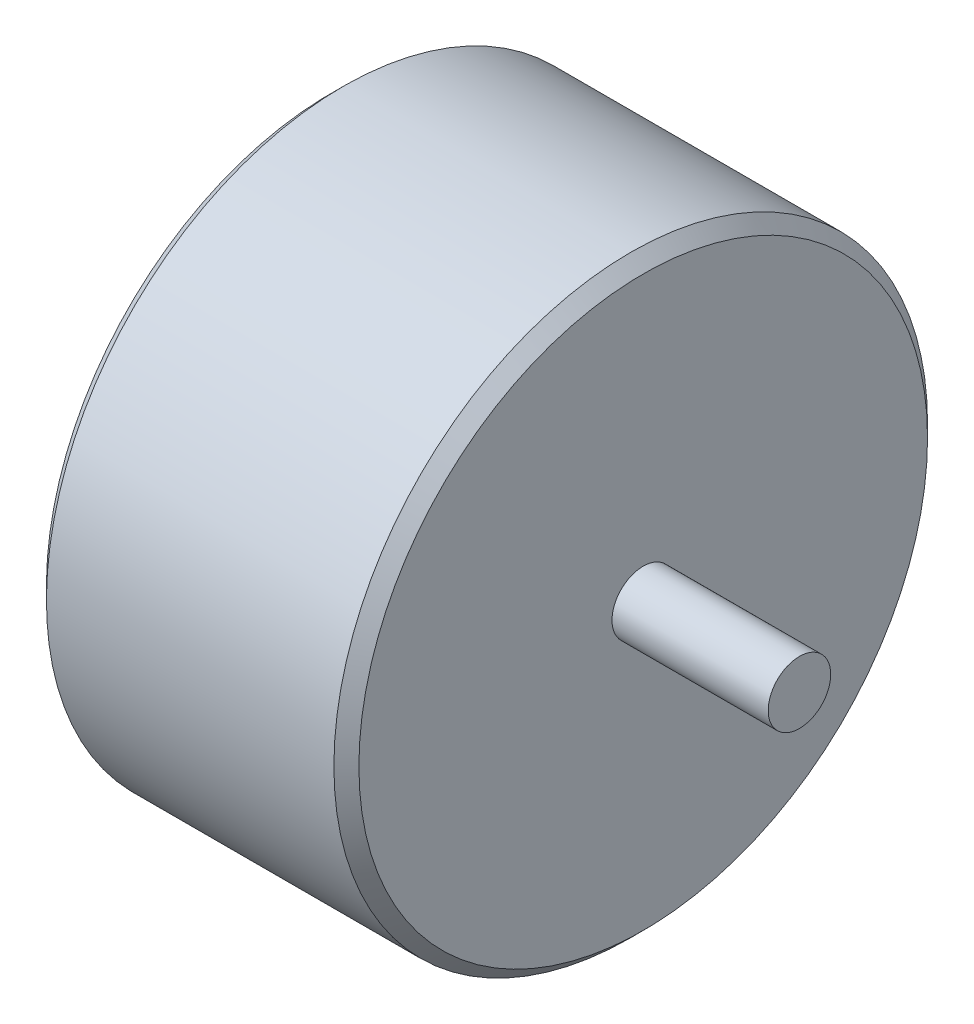
ISO-10303-21;
HEADER;
FILE_DESCRIPTION(('STEP AP214'),'2;1');
FILE_NAME('part.step','',(''),(''),'','','');
FILE_SCHEMA(('AUTOMOTIVE_DESIGN { 1 0 10303 214 1 1 1 1 }'));
ENDSEC;
DATA;
#1=APPLICATION_CONTEXT('core data for automotive mechanical design processes');
#2=APPLICATION_PROTOCOL_DEFINITION('international standard','automotive_design',2000,#1);
#3=PRODUCT_CONTEXT('',#1,'mechanical');
#4=PRODUCT('Part','Part','',(#3));
#5=PRODUCT_RELATED_PRODUCT_CATEGORY('part','',(#4));
#6=PRODUCT_DEFINITION_FORMATION('','',#4);
#7=PRODUCT_DEFINITION_CONTEXT('part definition',#1,'design');
#8=PRODUCT_DEFINITION('design','',#6,#7);
#9=PRODUCT_DEFINITION_SHAPE('','',#8);
#10=(LENGTH_UNIT() NAMED_UNIT(*) SI_UNIT(.MILLI.,.METRE.));
#11=(NAMED_UNIT(*) PLANE_ANGLE_UNIT() SI_UNIT($,.RADIAN.));
#12=(NAMED_UNIT(*) SI_UNIT($,.STERADIAN.) SOLID_ANGLE_UNIT());
#13=UNCERTAINTY_MEASURE_WITH_UNIT(LENGTH_MEASURE(1.E-05),#10,'distance_accuracy_value','');
#14=(GEOMETRIC_REPRESENTATION_CONTEXT(3) GLOBAL_UNCERTAINTY_ASSIGNED_CONTEXT((#13)) GLOBAL_UNIT_ASSIGNED_CONTEXT((#10,
#11,#12)) REPRESENTATION_CONTEXT('',''));
#15=CARTESIAN_POINT('',(0.,0.,0.));
#16=DIRECTION('',(0.,0.,1.));
#17=DIRECTION('',(1.,0.,0.));
#18=AXIS2_PLACEMENT_3D('',#15,#16,#17);
#19=CARTESIAN_POINT('',(12.7,0.,0.));
#20=DIRECTION('',(-1.,0.,0.));
#21=DIRECTION('',(0.,0.,1.));
#22=AXIS2_PLACEMENT_3D('',#19,#20,#21);
#23=CYLINDRICAL_SURFACE('',#22,12.065);
#24=CARTESIAN_POINT('',(12.192,0.,0.));
#25=DIRECTION('',(1.,0.,0.));
#26=DIRECTION('',(0.,0.,-1.));
#27=AXIS2_PLACEMENT_3D('',#24,#25,#26);
#28=CIRCLE('',#27,12.065);
#29=CARTESIAN_POINT('',(12.192,0.,-12.065));
#30=VERTEX_POINT('',#29);
#31=EDGE_CURVE('E127',#30,#30,#28,.F.);
#32=ORIENTED_EDGE('',*,*,#31,.T.);
#33=EDGE_LOOP('',(#32));
#34=FACE_BOUND('',#33,.T.);
#35=DIRECTION('',(-1.,0.,0.));
#36=VECTOR('',#35,1.);
#37=CARTESIAN_POINT('',(12.7,4.15899426881129,-11.3255018287048));
#38=LINE('',#37,#36);
#39=CARTESIAN_POINT('',(3.81,4.15899426881129,-11.3255018287048));
#40=VERTEX_POINT('',#39);
#41=CARTESIAN_POINT('',(0.507999999999998,4.15899426881129,-11.3255018287048));
#42=VERTEX_POINT('',#41);
#43=EDGE_CURVE('E99',#40,#42,#38,.T.);
#44=ORIENTED_EDGE('',*,*,#43,.T.);
#45=CARTESIAN_POINT('',(0.507999999999998,0.,0.));
#46=DIRECTION('',(1.,0.,0.));
#47=DIRECTION('',(0.,0.,-1.));
#48=AXIS2_PLACEMENT_3D('',#45,#46,#47);
#49=CIRCLE('',#48,12.065);
#50=CARTESIAN_POINT('',(0.507999999999998,-3.6130259091989,-11.5113104718558));
#51=VERTEX_POINT('',#50);
#52=EDGE_CURVE('E130',#42,#51,#49,.T.);
#53=ORIENTED_EDGE('',*,*,#52,.T.);
#54=DIRECTION('',(-1.,0.,0.));
#55=VECTOR('',#54,1.);
#56=CARTESIAN_POINT('',(12.7,-3.6130259091989,-11.5113104718558));
#57=LINE('',#56,#55);
#58=CARTESIAN_POINT('',(3.81,-3.6130259091989,-11.5113104718558));
#59=VERTEX_POINT('',#58);
#60=EDGE_CURVE('E115',#51,#59,#57,.F.);
#61=ORIENTED_EDGE('',*,*,#60,.T.);
#62=CARTESIAN_POINT('',(3.81,0.,0.));
#63=DIRECTION('',(1.,0.,0.));
#64=DIRECTION('',(0.,0.,-1.));
#65=AXIS2_PLACEMENT_3D('',#62,#63,#64);
#66=CIRCLE('',#65,12.065);
#67=EDGE_CURVE('E125',#59,#40,#66,.T.);
#68=ORIENTED_EDGE('',*,*,#67,.T.);
#69=EDGE_LOOP('',(#44,#53,#61,#68));
#70=FACE_BOUND('',#69,.T.);
#71=ADVANCED_FACE('F35',(#34,#70),#23,.T.);
#72=CARTESIAN_POINT('',(12.7,0.,0.));
#73=DIRECTION('',(1.,0.,0.));
#74=DIRECTION('',(0.,0.,-1.));
#75=AXIS2_PLACEMENT_3D('',#72,#73,#74);
#76=PLANE('',#75);
#77=CARTESIAN_POINT('',(12.7,0.,0.));
#78=DIRECTION('',(1.,0.,0.));
#79=DIRECTION('',(0.,0.,-1.));
#80=AXIS2_PLACEMENT_3D('',#77,#78,#79);
#81=CIRCLE('',#80,11.557);
#82=CARTESIAN_POINT('',(12.7,0.,-11.557));
#83=VERTEX_POINT('',#82);
#84=EDGE_CURVE('E11',#83,#83,#81,.T.);
#85=ORIENTED_EDGE('',*,*,#84,.T.);
#86=EDGE_LOOP('',(#85));
#87=FACE_BOUND('',#86,.T.);
#88=CARTESIAN_POINT('',(12.7,0.,0.));
#89=DIRECTION('',(1.,0.,0.));
#90=DIRECTION('',(0.,0.,-1.));
#91=AXIS2_PLACEMENT_3D('',#88,#89,#90);
#92=CIRCLE('',#91,1.27);
#93=CARTESIAN_POINT('',(12.7,0.,-1.27));
#94=VERTEX_POINT('',#93);
#95=EDGE_CURVE('E117',#94,#94,#92,.T.);
#96=ORIENTED_EDGE('',*,*,#95,.F.);
#97=EDGE_LOOP('',(#96));
#98=FACE_BOUND('',#97,.T.);
#99=ADVANCED_FACE('F164',(#87,#98),#76,.T.);
#100=CARTESIAN_POINT('',(0.,0.,0.));
#101=DIRECTION('',(1.,0.,0.));
#102=DIRECTION('',(0.,0.,-1.));
#103=AXIS2_PLACEMENT_3D('',#100,#101,#102);
#104=PLANE('',#103);
#105=DIRECTION('',(0.,0.,-1.));
#106=VECTOR('',#105,1.);
#107=CARTESIAN_POINT('',(0.,-3.6130259091989,0.));
#108=LINE('',#107,#106);
#109=CARTESIAN_POINT('',(0.,-3.6130259091989,-8.67126218207749));
#110=VERTEX_POINT('',#109);
#111=CARTESIAN_POINT('',(0.,-3.6130259091989,-10.9777180132966));
#112=VERTEX_POINT('',#111);
#113=EDGE_CURVE('E121',#110,#112,#108,.T.);
#114=ORIENTED_EDGE('',*,*,#113,.T.);
#115=CARTESIAN_POINT('',(0.,0.,0.));
#116=DIRECTION('',(1.,0.,0.));
#117=DIRECTION('',(0.,0.,-1.));
#118=AXIS2_PLACEMENT_3D('',#115,#116,#117);
#119=CIRCLE('',#118,11.557);
#120=CARTESIAN_POINT('',(0.,4.15899426881129,-10.7827183804454));
#121=VERTEX_POINT('',#120);
#122=EDGE_CURVE('E50',#112,#121,#119,.F.);
#123=ORIENTED_EDGE('',*,*,#122,.T.);
#124=DIRECTION('',(0.,0.,-1.));
#125=VECTOR('',#124,1.);
#126=CARTESIAN_POINT('',(0.,4.15899426881129,-8.67126218207749));
#127=LINE('',#126,#125);
#128=CARTESIAN_POINT('',(0.,4.15899426881129,-8.67126218207749));
#129=VERTEX_POINT('',#128);
#130=EDGE_CURVE('E107',#129,#121,#127,.T.);
#131=ORIENTED_EDGE('',*,*,#130,.F.);
#132=DIRECTION('',(0.,1.,0.));
#133=VECTOR('',#132,1.);
#134=CARTESIAN_POINT('',(0.,4.15899426881129,-8.67126218207749));
#135=LINE('',#134,#133);
#136=EDGE_CURVE('E90',#110,#129,#135,.T.);
#137=ORIENTED_EDGE('',*,*,#136,.F.);
#138=EDGE_LOOP('',(#114,#123,#131,#137));
#139=FACE_BOUND('',#138,.T.);
#140=ADVANCED_FACE('F169',(#139),#104,.F.);
#141=CARTESIAN_POINT('',(19.05,0.,0.));
#142=DIRECTION('',(-1.,0.,0.));
#143=DIRECTION('',(0.,0.,1.));
#144=AXIS2_PLACEMENT_3D('',#141,#142,#143);
#145=CYLINDRICAL_SURFACE('',#144,1.27);
#146=CARTESIAN_POINT('',(19.05,0.,0.));
#147=DIRECTION('',(1.,0.,0.));
#148=DIRECTION('',(0.,0.,-1.));
#149=AXIS2_PLACEMENT_3D('',#146,#147,#148);
#150=CIRCLE('',#149,1.27);
#151=CARTESIAN_POINT('',(19.05,0.,-1.27));
#152=VERTEX_POINT('',#151);
#153=EDGE_CURVE('E118',#152,#152,#150,.T.);
#154=ORIENTED_EDGE('',*,*,#153,.F.);
#155=EDGE_LOOP('',(#154));
#156=FACE_BOUND('',#155,.T.);
#157=ORIENTED_EDGE('',*,*,#95,.T.);
#158=EDGE_LOOP('',(#157));
#159=FACE_BOUND('',#158,.T.);
#160=ADVANCED_FACE('F174',(#156,#159),#145,.T.);
#161=CARTESIAN_POINT('',(19.05,0.,0.));
#162=DIRECTION('',(1.,0.,0.));
#163=DIRECTION('',(0.,0.,-1.));
#164=AXIS2_PLACEMENT_3D('',#161,#162,#163);
#165=PLANE('',#164);
#166=ORIENTED_EDGE('',*,*,#153,.T.);
#167=EDGE_LOOP('',(#166));
#168=FACE_BOUND('',#167,.T.);
#169=ADVANCED_FACE('F177',(#168),#165,.T.);
#170=CARTESIAN_POINT('',(3.81,0.,0.));
#171=DIRECTION('',(1.,0.,0.));
#172=DIRECTION('',(0.,0.,-1.));
#173=AXIS2_PLACEMENT_3D('',#170,#171,#172);
#174=PLANE('',#173);
#175=DIRECTION('',(0.,0.,1.));
#176=VECTOR('',#175,1.);
#177=CARTESIAN_POINT('',(3.81,-3.6130259091989,-8.67126218207749));
#178=LINE('',#177,#176);
#179=CARTESIAN_POINT('',(3.81,-3.6130259091989,-8.67126218207749));
#180=VERTEX_POINT('',#179);
#181=EDGE_CURVE('E93',#59,#180,#178,.T.);
#182=ORIENTED_EDGE('',*,*,#181,.T.);
#183=DIRECTION('',(0.,1.,0.));
#184=VECTOR('',#183,1.);
#185=CARTESIAN_POINT('',(3.81,4.15899426881129,-8.67126218207749));
#186=LINE('',#185,#184);
#187=CARTESIAN_POINT('',(3.81,4.15899426881129,-8.67126218207749));
#188=VERTEX_POINT('',#187);
#189=EDGE_CURVE('E88',#180,#188,#186,.T.);
#190=ORIENTED_EDGE('',*,*,#189,.T.);
#191=DIRECTION('',(0.,0.,-1.));
#192=VECTOR('',#191,1.);
#193=CARTESIAN_POINT('',(3.81,4.15899426881129,-8.67126218207749));
#194=LINE('',#193,#192);
#195=EDGE_CURVE('E96',#188,#40,#194,.T.);
#196=ORIENTED_EDGE('',*,*,#195,.T.);
#197=ORIENTED_EDGE('',*,*,#67,.F.);
#198=EDGE_LOOP('',(#182,#190,#196,#197));
#199=FACE_BOUND('',#198,.T.);
#200=ADVANCED_FACE('F104',(#199),#174,.F.);
#201=CARTESIAN_POINT('',(3.81,-3.6130259091989,-8.67126218207749));
#202=DIRECTION('',(0.,-1.,0.));
#203=DIRECTION('',(0.,0.,-1.));
#204=AXIS2_PLACEMENT_3D('',#201,#202,#203);
#205=PLANE('',#204);
#206=ORIENTED_EDGE('',*,*,#60,.F.);
#207=CARTESIAN_POINT('',(0.507999999999998,-3.6130259091989,-11.5113104718558));
#208=CARTESIAN_POINT('',(0.423234675561065,-3.6130259091989,-11.4224723224444));
#209=CARTESIAN_POINT('',(0.338518680288051,-3.6130259091989,-11.3335872098199));
#210=CARTESIAN_POINT('',(0.169185346953412,-3.6130259091989,-11.1557230569681));
#211=CARTESIAN_POINT('',(0.0845680088930941,-3.6130259091989,-11.0667440167395));
#212=CARTESIAN_POINT('',(0.,-3.6130259091989,-10.9777180132966));
#213=B_SPLINE_CURVE_WITH_KNOTS('',3,(#207,#208,#209,#210,#211,#212),.UNSPECIFIED.,.F.,.F.,(4,2,
4),(0.,0.368369743480988,0.736739491836834),.UNSPECIFIED.);
#214=EDGE_CURVE('E58',#51,#112,#213,.T.);
#215=ORIENTED_EDGE('',*,*,#214,.T.);
#216=ORIENTED_EDGE('',*,*,#113,.F.);
#217=DIRECTION('',(-1.,0.,0.));
#218=VECTOR('',#217,1.);
#219=CARTESIAN_POINT('',(3.81,-3.6130259091989,-8.67126218207749));
#220=LINE('',#219,#218);
#221=EDGE_CURVE('E92',#180,#110,#220,.T.);
#222=ORIENTED_EDGE('',*,*,#221,.F.);
#223=ORIENTED_EDGE('',*,*,#181,.F.);
#224=EDGE_LOOP('',(#206,#215,#216,#222,#223));
#225=FACE_BOUND('',#224,.T.);
#226=ADVANCED_FACE('F141',(#225),#205,.F.);
#227=CARTESIAN_POINT('',(3.81,4.15899426881129,-8.67126218207749));
#228=DIRECTION('',(0.,1.,0.));
#229=DIRECTION('',(0.,0.,1.));
#230=AXIS2_PLACEMENT_3D('',#227,#228,#229);
#231=PLANE('',#230);
#232=ORIENTED_EDGE('',*,*,#130,.T.);
#233=CARTESIAN_POINT('',(0.,4.15899426881129,-10.7827183804454));
#234=CARTESIAN_POINT('',(0.0845292003769815,4.15899426881129,-10.873310947568));
#235=CARTESIAN_POINT('',(0.16912713442523,4.15899426881129,-10.9638391857117));
#236=CARTESIAN_POINT('',(0.338460467761977,4.15899426881129,-11.1447670017949));
#237=CARTESIAN_POINT('',(0.423195867047061,4.15899426881129,-11.2351665797377));
#238=CARTESIAN_POINT('',(0.507999999999999,4.15899426881129,-11.3255018287048));
#239=B_SPLINE_CURVE_WITH_KNOTS('',3,(#233,#234,#235,#236,#237,#238),.UNSPECIFIED.,.F.,.F.,(4,2,
4),(0.,0.371711650503001,0.743423291776346),.UNSPECIFIED.);
#240=EDGE_CURVE('E43',#121,#42,#239,.T.);
#241=ORIENTED_EDGE('',*,*,#240,.T.);
#242=ORIENTED_EDGE('',*,*,#43,.F.);
#243=ORIENTED_EDGE('',*,*,#195,.F.);
#244=DIRECTION('',(-1.,0.,0.));
#245=VECTOR('',#244,1.);
#246=CARTESIAN_POINT('',(3.81,4.15899426881129,-8.67126218207749));
#247=LINE('',#246,#245);
#248=EDGE_CURVE('E83',#188,#129,#247,.T.);
#249=ORIENTED_EDGE('',*,*,#248,.T.);
#250=EDGE_LOOP('',(#232,#241,#242,#243,#249));
#251=FACE_BOUND('',#250,.T.);
#252=ADVANCED_FACE('F97',(#251),#231,.F.);
#253=CARTESIAN_POINT('',(3.81,4.15899426881129,-8.67126218207749));
#254=DIRECTION('',(0.,0.,1.));
#255=DIRECTION('',(1.,0.,0.));
#256=AXIS2_PLACEMENT_3D('',#253,#254,#255);
#257=PLANE('',#256);
#258=ORIENTED_EDGE('',*,*,#136,.T.);
#259=ORIENTED_EDGE('',*,*,#248,.F.);
#260=ORIENTED_EDGE('',*,*,#189,.F.);
#261=ORIENTED_EDGE('',*,*,#221,.T.);
#262=EDGE_LOOP('',(#258,#259,#260,#261));
#263=FACE_BOUND('',#262,.T.);
#264=ADVANCED_FACE('F85',(#263),#257,.F.);
#265=CARTESIAN_POINT('',(0.507999999999998,0.,0.));
#266=DIRECTION('',(1.,0.,0.));
#267=DIRECTION('',(0.,0.,-1.));
#268=AXIS2_PLACEMENT_3D('',#265,#266,#267);
#269=CONICAL_SURFACE('',#268,12.065,0.785398163397448);
#270=ORIENTED_EDGE('',*,*,#240,.F.);
#271=ORIENTED_EDGE('',*,*,#122,.F.);
#272=ORIENTED_EDGE('',*,*,#214,.F.);
#273=ORIENTED_EDGE('',*,*,#52,.F.);
#274=EDGE_LOOP('',(#270,#271,#272,#273));
#275=FACE_BOUND('',#274,.T.);
#276=ADVANCED_FACE('F138',(#275),#269,.T.);
#277=CARTESIAN_POINT('',(12.7,0.,0.));
#278=DIRECTION('',(-1.,0.,0.));
#279=DIRECTION('',(0.,0.,1.));
#280=AXIS2_PLACEMENT_3D('',#277,#278,#279);
#281=CONICAL_SURFACE('',#280,11.557,0.78539816339744);
#282=ORIENTED_EDGE('',*,*,#31,.F.);
#283=EDGE_LOOP('',(#282));
#284=FACE_BOUND('',#283,.T.);
#285=ORIENTED_EDGE('',*,*,#84,.F.);
#286=EDGE_LOOP('',(#285));
#287=FACE_BOUND('',#286,.T.);
#288=ADVANCED_FACE('F37',(#284,#287),#281,.T.);
#289=CLOSED_SHELL('',(#71,#99,#140,#160,#169,#200,#226,#252,#264,#276,#288));
#290=MANIFOLD_SOLID_BREP('B2',#289);
#291=ADVANCED_BREP_SHAPE_REPRESENTATION('',(#18,#290),#14);
#292=SHAPE_DEFINITION_REPRESENTATION(#9,#291);
ENDSEC;
END-ISO-10303-21;
